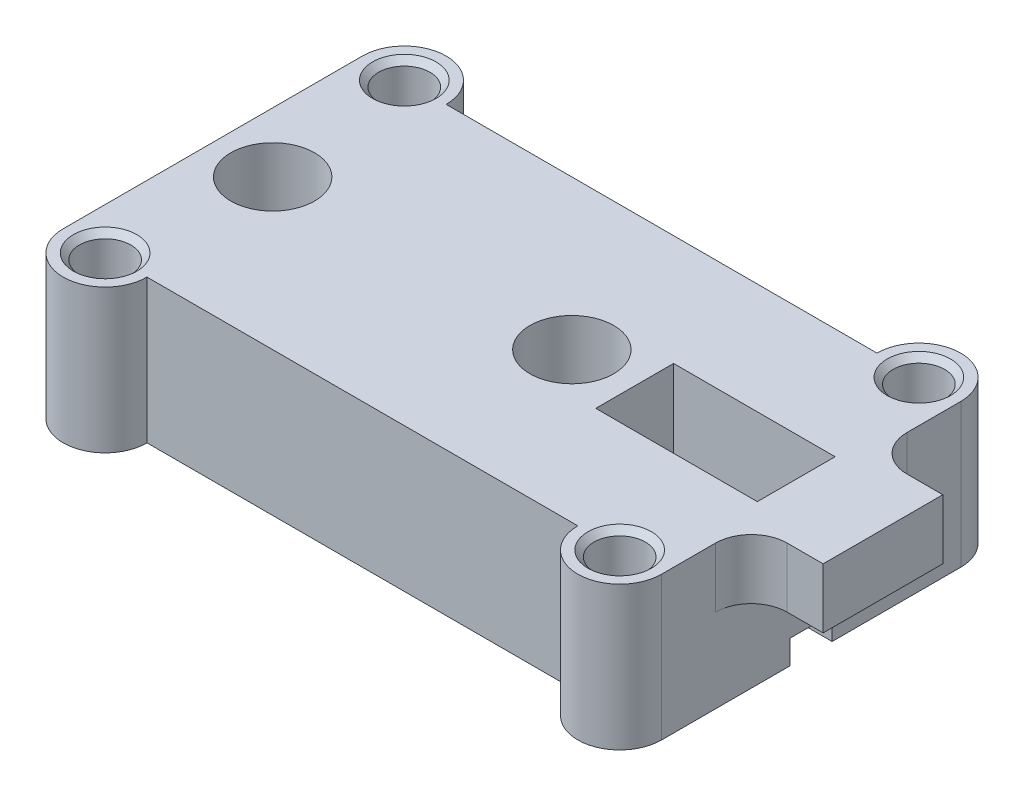
ISO-10303-21;
HEADER;
FILE_DESCRIPTION(('STEP AP214'),'2;1');
FILE_NAME('part.step','',(''),(''),'','','');
FILE_SCHEMA(('AUTOMOTIVE_DESIGN { 1 0 10303 214 1 1 1 1 }'));
ENDSEC;
DATA;
#1=APPLICATION_CONTEXT('core data for automotive mechanical design processes');
#2=APPLICATION_PROTOCOL_DEFINITION('international standard','automotive_design',2000,#1);
#3=PRODUCT_CONTEXT('',#1,'mechanical');
#4=PRODUCT('Part','Part','',(#3));
#5=PRODUCT_RELATED_PRODUCT_CATEGORY('part','',(#4));
#6=PRODUCT_DEFINITION_FORMATION('','',#4);
#7=PRODUCT_DEFINITION_CONTEXT('part definition',#1,'design');
#8=PRODUCT_DEFINITION('design','',#6,#7);
#9=PRODUCT_DEFINITION_SHAPE('','',#8);
#10=(LENGTH_UNIT() NAMED_UNIT(*) SI_UNIT(.MILLI.,.METRE.));
#11=(NAMED_UNIT(*) PLANE_ANGLE_UNIT() SI_UNIT($,.RADIAN.));
#12=(NAMED_UNIT(*) SI_UNIT($,.STERADIAN.) SOLID_ANGLE_UNIT());
#13=UNCERTAINTY_MEASURE_WITH_UNIT(LENGTH_MEASURE(1.E-05),#10,'distance_accuracy_value','');
#14=(GEOMETRIC_REPRESENTATION_CONTEXT(3) GLOBAL_UNCERTAINTY_ASSIGNED_CONTEXT((#13)) GLOBAL_UNIT_ASSIGNED_CONTEXT((#10,
#11,#12)) REPRESENTATION_CONTEXT('',''));
#15=CARTESIAN_POINT('',(0.,0.,0.));
#16=DIRECTION('',(0.,0.,1.));
#17=DIRECTION('',(1.,0.,0.));
#18=AXIS2_PLACEMENT_3D('',#15,#16,#17);
#19=CARTESIAN_POINT('',(-20.,12.,0.));
#20=DIRECTION('',(0.,-1.,0.));
#21=DIRECTION('',(0.,0.,1.));
#22=AXIS2_PLACEMENT_3D('',#19,#20,#21);
#23=CYLINDRICAL_SURFACE('',#22,1.75);
#24=CARTESIAN_POINT('',(-20.,0.,0.));
#25=DIRECTION('',(0.,-1.,0.));
#26=DIRECTION('',(0.,0.,-1.));
#27=AXIS2_PLACEMENT_3D('',#24,#25,#26);
#28=CIRCLE('',#27,1.75);
#29=CARTESIAN_POINT('',(-20.,0.,-1.75));
#30=VERTEX_POINT('',#29);
#31=EDGE_CURVE('E446',#30,#30,#28,.T.);
#32=ORIENTED_EDGE('',*,*,#31,.T.);
#33=EDGE_LOOP('',(#32));
#34=FACE_BOUND('',#33,.T.);
#35=CARTESIAN_POINT('',(-20.,3.5,0.));
#36=DIRECTION('',(0.,-1.,0.));
#37=DIRECTION('',(0.,0.,-1.));
#38=AXIS2_PLACEMENT_3D('',#35,#36,#37);
#39=CIRCLE('',#38,1.75);
#40=CARTESIAN_POINT('',(-20.,3.5,-1.75));
#41=VERTEX_POINT('',#40);
#42=EDGE_CURVE('E320',#41,#41,#39,.F.);
#43=ORIENTED_EDGE('',*,*,#42,.T.);
#44=EDGE_LOOP('',(#43));
#45=FACE_BOUND('',#44,.T.);
#46=ADVANCED_FACE('F45',(#34,#45),#23,.F.);
#47=CARTESIAN_POINT('',(5.,12.,0.));
#48=DIRECTION('',(0.,-1.,0.));
#49=DIRECTION('',(0.,0.,1.));
#50=AXIS2_PLACEMENT_3D('',#47,#48,#49);
#51=CYLINDRICAL_SURFACE('',#50,1.75);
#52=CARTESIAN_POINT('',(5.,0.,0.));
#53=DIRECTION('',(0.,-1.,0.));
#54=DIRECTION('',(0.,0.,-1.));
#55=AXIS2_PLACEMENT_3D('',#52,#53,#54);
#56=CIRCLE('',#55,1.75);
#57=CARTESIAN_POINT('',(5.,0.,-1.75));
#58=VERTEX_POINT('',#57);
#59=EDGE_CURVE('E244',#58,#58,#56,.T.);
#60=ORIENTED_EDGE('',*,*,#59,.T.);
#61=EDGE_LOOP('',(#60));
#62=FACE_BOUND('',#61,.T.);
#63=CARTESIAN_POINT('',(5.,3.5,0.));
#64=DIRECTION('',(0.,-1.,0.));
#65=DIRECTION('',(0.,0.,-1.));
#66=AXIS2_PLACEMENT_3D('',#63,#64,#65);
#67=CIRCLE('',#66,1.75);
#68=CARTESIAN_POINT('',(5.,3.5,-1.75));
#69=VERTEX_POINT('',#68);
#70=EDGE_CURVE('E330',#69,#69,#67,.F.);
#71=ORIENTED_EDGE('',*,*,#70,.T.);
#72=EDGE_LOOP('',(#71));
#73=FACE_BOUND('',#72,.T.);
#74=ADVANCED_FACE('F514',(#62,#73),#51,.F.);
#75=CARTESIAN_POINT('',(0.,12.,1.75));
#76=DIRECTION('',(0.,0.,1.));
#77=DIRECTION('',(-1.,0.,0.));
#78=AXIS2_PLACEMENT_3D('',#75,#76,#77);
#79=PLANE('',#78);
#80=DIRECTION('',(-1.,0.,0.));
#81=VECTOR('',#80,1.);
#82=CARTESIAN_POINT('',(0.,2.7,1.75));
#83=LINE('',#82,#81);
#84=CARTESIAN_POINT('',(23.75,2.7,1.75));
#85=VERTEX_POINT('',#84);
#86=CARTESIAN_POINT('',(10.25,2.7,1.75));
#87=VERTEX_POINT('',#86);
#88=EDGE_CURVE('E233',#85,#87,#83,.T.);
#89=ORIENTED_EDGE('',*,*,#88,.F.);
#90=DIRECTION('',(0.,-1.,0.));
#91=VECTOR('',#90,1.);
#92=CARTESIAN_POINT('',(23.75,12.,1.75));
#93=LINE('',#92,#91);
#94=CARTESIAN_POINT('',(23.75,2.,1.75));
#95=VERTEX_POINT('',#94);
#96=EDGE_CURVE('E213',#85,#95,#93,.T.);
#97=ORIENTED_EDGE('',*,*,#96,.T.);
#98=DIRECTION('',(1.,0.,0.));
#99=VECTOR('',#98,1.);
#100=CARTESIAN_POINT('',(0.,2.,1.75));
#101=LINE('',#100,#99);
#102=CARTESIAN_POINT('',(25.,2.,1.75));
#103=VERTEX_POINT('',#102);
#104=EDGE_CURVE('E220',#95,#103,#101,.T.);
#105=ORIENTED_EDGE('',*,*,#104,.T.);
#106=DIRECTION('',(0.,-1.,0.));
#107=VECTOR('',#106,1.);
#108=CARTESIAN_POINT('',(25.,2.,1.75));
#109=LINE('',#108,#107);
#110=CARTESIAN_POINT('',(25.,0.,1.75));
#111=VERTEX_POINT('',#110);
#112=EDGE_CURVE('E475',#103,#111,#109,.T.);
#113=ORIENTED_EDGE('',*,*,#112,.T.);
#114=DIRECTION('',(1.,0.,0.));
#115=VECTOR('',#114,1.);
#116=CARTESIAN_POINT('',(0.,0.,1.75));
#117=LINE('',#116,#115);
#118=CARTESIAN_POINT('',(10.25,0.,1.75));
#119=VERTEX_POINT('',#118);
#120=EDGE_CURVE('E444',#119,#111,#117,.T.);
#121=ORIENTED_EDGE('',*,*,#120,.F.);
#122=DIRECTION('',(0.,-1.,0.));
#123=VECTOR('',#122,1.);
#124=CARTESIAN_POINT('',(10.25,12.,1.75));
#125=LINE('',#124,#123);
#126=EDGE_CURVE('E234',#87,#119,#125,.T.);
#127=ORIENTED_EDGE('',*,*,#126,.F.);
#128=EDGE_LOOP('',(#89,#97,#105,#113,#121,#127));
#129=FACE_BOUND('',#128,.T.);
#130=ADVANCED_FACE('F230',(#129),#79,.F.);
#131=CARTESIAN_POINT('',(0.,12.,0.));
#132=DIRECTION('',(0.,1.,0.));
#133=DIRECTION('',(0.,0.,-1.));
#134=AXIS2_PLACEMENT_3D('',#131,#132,#133);
#135=PLANE('',#134);
#136=CARTESIAN_POINT('',(21.5,12.,12.5));
#137=DIRECTION('',(0.,-1.,0.));
#138=DIRECTION('',(0.,0.,-1.));
#139=AXIS2_PLACEMENT_3D('',#136,#137,#138);
#140=CIRCLE('',#139,2.64999999999999);
#141=CARTESIAN_POINT('',(21.5,12.,9.85000000000001));
#142=VERTEX_POINT('',#141);
#143=EDGE_CURVE('E299',#142,#142,#140,.F.);
#144=ORIENTED_EDGE('',*,*,#143,.F.);
#145=EDGE_LOOP('',(#144));
#146=FACE_BOUND('',#145,.T.);
#147=CARTESIAN_POINT('',(-21.5,12.,12.5));
#148=DIRECTION('',(0.,-1.,0.));
#149=DIRECTION('',(0.,0.,-1.));
#150=AXIS2_PLACEMENT_3D('',#147,#148,#149);
#151=CIRCLE('',#150,2.64999999999999);
#152=CARTESIAN_POINT('',(-21.5,12.,9.85000000000001));
#153=VERTEX_POINT('',#152);
#154=EDGE_CURVE('E296',#153,#153,#151,.F.);
#155=ORIENTED_EDGE('',*,*,#154,.F.);
#156=EDGE_LOOP('',(#155));
#157=FACE_BOUND('',#156,.T.);
#158=CARTESIAN_POINT('',(-21.5,12.,-12.5));
#159=DIRECTION('',(0.,-1.,0.));
#160=DIRECTION('',(0.,0.,-1.));
#161=AXIS2_PLACEMENT_3D('',#158,#159,#160);
#162=CIRCLE('',#161,2.64999999999999);
#163=CARTESIAN_POINT('',(-21.5,12.,-15.15));
#164=VERTEX_POINT('',#163);
#165=EDGE_CURVE('E293',#164,#164,#162,.F.);
#166=ORIENTED_EDGE('',*,*,#165,.F.);
#167=EDGE_LOOP('',(#166));
#168=FACE_BOUND('',#167,.T.);
#169=CARTESIAN_POINT('',(21.5,12.,-12.5));
#170=DIRECTION('',(0.,-1.,0.));
#171=DIRECTION('',(0.,0.,-1.));
#172=AXIS2_PLACEMENT_3D('',#169,#170,#171);
#173=CIRCLE('',#172,2.64999999999999);
#174=CARTESIAN_POINT('',(21.5,12.,-15.15));
#175=VERTEX_POINT('',#174);
#176=EDGE_CURVE('E290',#175,#175,#173,.F.);
#177=ORIENTED_EDGE('',*,*,#176,.F.);
#178=EDGE_LOOP('',(#177));
#179=FACE_BOUND('',#178,.T.);
#180=CARTESIAN_POINT('',(-20.,12.,0.));
#181=DIRECTION('',(0.,-1.,0.));
#182=DIRECTION('',(0.,0.,-1.));
#183=AXIS2_PLACEMENT_3D('',#180,#181,#182);
#184=CIRCLE('',#183,3.5);
#185=CARTESIAN_POINT('',(-20.,12.,-3.5));
#186=VERTEX_POINT('',#185);
#187=EDGE_CURVE('E486',#186,#186,#184,.T.);
#188=ORIENTED_EDGE('',*,*,#187,.T.);
#189=EDGE_LOOP('',(#188));
#190=FACE_BOUND('',#189,.T.);
#191=CARTESIAN_POINT('',(5.,12.,0.));
#192=DIRECTION('',(0.,-1.,0.));
#193=DIRECTION('',(0.,0.,-1.));
#194=AXIS2_PLACEMENT_3D('',#191,#192,#193);
#195=CIRCLE('',#194,3.5);
#196=CARTESIAN_POINT('',(5.,12.,-3.5));
#197=VERTEX_POINT('',#196);
#198=EDGE_CURVE('E479',#197,#197,#195,.T.);
#199=ORIENTED_EDGE('',*,*,#198,.T.);
#200=EDGE_LOOP('',(#199));
#201=FACE_BOUND('',#200,.T.);
#202=DIRECTION('',(0.,0.,1.));
#203=VECTOR('',#202,1.);
#204=CARTESIAN_POINT('',(25.,12.,0.));
#205=LINE('',#204,#203);
#206=CARTESIAN_POINT('',(25.,12.,-12.5));
#207=VERTEX_POINT('',#206);
#208=CARTESIAN_POINT('',(25.,12.,-8.00000000000001));
#209=VERTEX_POINT('',#208);
#210=EDGE_CURVE('E391',#207,#209,#205,.T.);
#211=ORIENTED_EDGE('',*,*,#210,.F.);
#212=CARTESIAN_POINT('',(21.5,12.,-12.5));
#213=DIRECTION('',(0.,-1.,0.));
#214=DIRECTION('',(0.,0.,-1.));
#215=AXIS2_PLACEMENT_3D('',#212,#213,#214);
#216=CIRCLE('',#215,3.5);
#217=CARTESIAN_POINT('',(18.,12.,-12.5));
#218=VERTEX_POINT('',#217);
#219=EDGE_CURVE('E413',#218,#207,#216,.T.);
#220=ORIENTED_EDGE('',*,*,#219,.F.);
#221=DIRECTION('',(1.,0.,0.));
#222=VECTOR('',#221,1.);
#223=CARTESIAN_POINT('',(0.,12.,-12.5));
#224=LINE('',#223,#222);
#225=CARTESIAN_POINT('',(-18.,12.,-12.5));
#226=VERTEX_POINT('',#225);
#227=EDGE_CURVE('E410',#226,#218,#224,.T.);
#228=ORIENTED_EDGE('',*,*,#227,.F.);
#229=CARTESIAN_POINT('',(-21.5,12.,-12.5));
#230=DIRECTION('',(0.,-1.,0.));
#231=DIRECTION('',(0.,0.,-1.));
#232=AXIS2_PLACEMENT_3D('',#229,#230,#231);
#233=CIRCLE('',#232,3.5);
#234=CARTESIAN_POINT('',(-25.,12.,-12.5));
#235=VERTEX_POINT('',#234);
#236=EDGE_CURVE('E407',#226,#235,#233,.F.);
#237=ORIENTED_EDGE('',*,*,#236,.T.);
#238=DIRECTION('',(0.,0.,1.));
#239=VECTOR('',#238,1.);
#240=CARTESIAN_POINT('',(-25.,12.,0.));
#241=LINE('',#240,#239);
#242=CARTESIAN_POINT('',(-25.,12.,12.5));
#243=VERTEX_POINT('',#242);
#244=EDGE_CURVE('E404',#235,#243,#241,.T.);
#245=ORIENTED_EDGE('',*,*,#244,.T.);
#246=CARTESIAN_POINT('',(-21.5,12.,12.5));
#247=DIRECTION('',(0.,-1.,0.));
#248=DIRECTION('',(0.,0.,-1.));
#249=AXIS2_PLACEMENT_3D('',#246,#247,#248);
#250=CIRCLE('',#249,3.5);
#251=CARTESIAN_POINT('',(-18.,12.,12.5));
#252=VERTEX_POINT('',#251);
#253=EDGE_CURVE('E401',#252,#243,#250,.T.);
#254=ORIENTED_EDGE('',*,*,#253,.F.);
#255=DIRECTION('',(1.,0.,0.));
#256=VECTOR('',#255,1.);
#257=CARTESIAN_POINT('',(0.,12.,12.5));
#258=LINE('',#257,#256);
#259=CARTESIAN_POINT('',(18.,12.,12.5));
#260=VERTEX_POINT('',#259);
#261=EDGE_CURVE('E398',#252,#260,#258,.T.);
#262=ORIENTED_EDGE('',*,*,#261,.T.);
#263=CARTESIAN_POINT('',(21.5,12.,12.5));
#264=DIRECTION('',(0.,-1.,0.));
#265=DIRECTION('',(0.,0.,-1.));
#266=AXIS2_PLACEMENT_3D('',#263,#264,#265);
#267=CIRCLE('',#266,3.5);
#268=CARTESIAN_POINT('',(25.,12.,12.5));
#269=VERTEX_POINT('',#268);
#270=EDGE_CURVE('E394',#260,#269,#267,.F.);
#271=ORIENTED_EDGE('',*,*,#270,.T.);
#272=CARTESIAN_POINT('',(25.,12.,7.99999999999999));
#273=VERTEX_POINT('',#272);
#274=EDGE_CURVE('E395',#273,#269,#205,.T.);
#275=ORIENTED_EDGE('',*,*,#274,.F.);
#276=CARTESIAN_POINT('',(28.,12.,7.99999999999999));
#277=DIRECTION('',(0.,-1.,0.));
#278=DIRECTION('',(0.,0.,-1.));
#279=AXIS2_PLACEMENT_3D('',#276,#277,#278);
#280=CIRCLE('',#279,3.);
#281=CARTESIAN_POINT('',(28.,12.,4.99999999999999));
#282=VERTEX_POINT('',#281);
#283=EDGE_CURVE('E279',#282,#273,#280,.F.);
#284=ORIENTED_EDGE('',*,*,#283,.F.);
#285=DIRECTION('',(1.,0.,0.));
#286=VECTOR('',#285,1.);
#287=CARTESIAN_POINT('',(0.,12.,4.99999999999999));
#288=LINE('',#287,#286);
#289=CARTESIAN_POINT('',(31.,12.,4.99999999999999));
#290=VERTEX_POINT('',#289);
#291=EDGE_CURVE('E357',#282,#290,#288,.T.);
#292=ORIENTED_EDGE('',*,*,#291,.T.);
#293=DIRECTION('',(0.,0.,1.));
#294=VECTOR('',#293,1.);
#295=CARTESIAN_POINT('',(31.,12.,0.));
#296=LINE('',#295,#294);
#297=CARTESIAN_POINT('',(31.,12.,-5.00000000000001));
#298=VERTEX_POINT('',#297);
#299=EDGE_CURVE('E383',#298,#290,#296,.T.);
#300=ORIENTED_EDGE('',*,*,#299,.F.);
#301=DIRECTION('',(1.,0.,0.));
#302=VECTOR('',#301,1.);
#303=CARTESIAN_POINT('',(0.,12.,-5.00000000000001));
#304=LINE('',#303,#302);
#305=CARTESIAN_POINT('',(28.,12.,-5.00000000000001));
#306=VERTEX_POINT('',#305);
#307=EDGE_CURVE('E374',#306,#298,#304,.T.);
#308=ORIENTED_EDGE('',*,*,#307,.F.);
#309=CARTESIAN_POINT('',(28.,12.,-8.00000000000001));
#310=DIRECTION('',(0.,-1.,0.));
#311=DIRECTION('',(0.,0.,-1.));
#312=AXIS2_PLACEMENT_3D('',#309,#310,#311);
#313=CIRCLE('',#312,3.);
#314=EDGE_CURVE('E284',#209,#306,#313,.F.);
#315=ORIENTED_EDGE('',*,*,#314,.F.);
#316=EDGE_LOOP('',(#211,#220,#228,#237,#245,#254,#262,#271,#275,#284,#292,#300,#308,#315));
#317=FACE_BOUND('',#316,.T.);
#318=DIRECTION('',(0.,0.,1.));
#319=VECTOR('',#318,1.);
#320=CARTESIAN_POINT('',(23.75,12.,0.));
#321=LINE('',#320,#319);
#322=CARTESIAN_POINT('',(23.75,12.,-3.25));
#323=VERTEX_POINT('',#322);
#324=CARTESIAN_POINT('',(23.75,12.,3.25));
#325=VERTEX_POINT('',#324);
#326=EDGE_CURVE('E416',#323,#325,#321,.T.);
#327=ORIENTED_EDGE('',*,*,#326,.T.);
#328=DIRECTION('',(-1.,0.,0.));
#329=VECTOR('',#328,1.);
#330=CARTESIAN_POINT('',(0.,12.,3.25));
#331=LINE('',#330,#329);
#332=CARTESIAN_POINT('',(10.25,12.,3.25));
#333=VERTEX_POINT('',#332);
#334=EDGE_CURVE('E337',#325,#333,#331,.T.);
#335=ORIENTED_EDGE('',*,*,#334,.T.);
#336=DIRECTION('',(0.,0.,1.));
#337=VECTOR('',#336,1.);
#338=CARTESIAN_POINT('',(10.25,12.,0.));
#339=LINE('',#338,#337);
#340=CARTESIAN_POINT('',(10.25,12.,-3.25));
#341=VERTEX_POINT('',#340);
#342=EDGE_CURVE('E255',#341,#333,#339,.T.);
#343=ORIENTED_EDGE('',*,*,#342,.F.);
#344=DIRECTION('',(-1.,0.,0.));
#345=VECTOR('',#344,1.);
#346=CARTESIAN_POINT('',(0.,12.,-3.25));
#347=LINE('',#346,#345);
#348=EDGE_CURVE('E342',#323,#341,#347,.T.);
#349=ORIENTED_EDGE('',*,*,#348,.F.);
#350=EDGE_LOOP('',(#327,#335,#343,#349));
#351=FACE_BOUND('',#350,.T.);
#352=ADVANCED_FACE('F462',(#146,#157,#168,#179,#190,#201,#317,#351),#135,.T.);
#353=CARTESIAN_POINT('',(25.,12.,0.));
#354=DIRECTION('',(-1.,0.,0.));
#355=DIRECTION('',(0.,0.,-1.));
#356=AXIS2_PLACEMENT_3D('',#353,#354,#355);
#357=PLANE('',#356);
#358=ORIENTED_EDGE('',*,*,#274,.T.);
#359=DIRECTION('',(0.,-1.,0.));
#360=VECTOR('',#359,1.);
#361=CARTESIAN_POINT('',(25.,12.,12.5));
#362=LINE('',#361,#360);
#363=CARTESIAN_POINT('',(25.,0.,12.5));
#364=VERTEX_POINT('',#363);
#365=EDGE_CURVE('E235',#269,#364,#362,.T.);
#366=ORIENTED_EDGE('',*,*,#365,.T.);
#367=DIRECTION('',(0.,0.,1.));
#368=VECTOR('',#367,1.);
#369=CARTESIAN_POINT('',(25.,0.,0.));
#370=LINE('',#369,#368);
#371=EDGE_CURVE('E390',#111,#364,#370,.T.);
#372=ORIENTED_EDGE('',*,*,#371,.F.);
#373=ORIENTED_EDGE('',*,*,#112,.F.);
#374=DIRECTION('',(0.,0.,1.));
#375=VECTOR('',#374,1.);
#376=CARTESIAN_POINT('',(25.,2.,0.));
#377=LINE('',#376,#375);
#378=CARTESIAN_POINT('',(25.,2.,-1.75));
#379=VERTEX_POINT('',#378);
#380=EDGE_CURVE('E225',#379,#103,#377,.T.);
#381=ORIENTED_EDGE('',*,*,#380,.F.);
#382=DIRECTION('',(0.,-1.,0.));
#383=VECTOR('',#382,1.);
#384=CARTESIAN_POINT('',(25.,2.,-1.75));
#385=LINE('',#384,#383);
#386=CARTESIAN_POINT('',(25.,0.,-1.75));
#387=VERTEX_POINT('',#386);
#388=EDGE_CURVE('E477',#379,#387,#385,.T.);
#389=ORIENTED_EDGE('',*,*,#388,.T.);
#390=CARTESIAN_POINT('',(25.,0.,-12.5));
#391=VERTEX_POINT('',#390);
#392=EDGE_CURVE('E421',#391,#387,#370,.T.);
#393=ORIENTED_EDGE('',*,*,#392,.F.);
#394=DIRECTION('',(0.,-1.,0.));
#395=VECTOR('',#394,1.);
#396=CARTESIAN_POINT('',(25.,12.,-12.5));
#397=LINE('',#396,#395);
#398=EDGE_CURVE('E251',#207,#391,#397,.T.);
#399=ORIENTED_EDGE('',*,*,#398,.F.);
#400=ORIENTED_EDGE('',*,*,#210,.T.);
#401=DIRECTION('',(0.,1.,0.));
#402=VECTOR('',#401,1.);
#403=CARTESIAN_POINT('',(25.,12.,-8.00000000000001));
#404=LINE('',#403,#402);
#405=CARTESIAN_POINT('',(25.,7.,-8.00000000000001));
#406=VERTEX_POINT('',#405);
#407=EDGE_CURVE('E273',#406,#209,#404,.T.);
#408=ORIENTED_EDGE('',*,*,#407,.F.);
#409=DIRECTION('',(0.,0.,-1.));
#410=VECTOR('',#409,1.);
#411=CARTESIAN_POINT('',(25.,7.,0.));
#412=LINE('',#411,#410);
#413=CARTESIAN_POINT('',(25.,7.,7.99999999999999));
#414=VERTEX_POINT('',#413);
#415=EDGE_CURVE('E378',#414,#406,#412,.T.);
#416=ORIENTED_EDGE('',*,*,#415,.F.);
#417=DIRECTION('',(0.,1.,0.));
#418=VECTOR('',#417,1.);
#419=CARTESIAN_POINT('',(25.,7.,7.99999999999999));
#420=LINE('',#419,#418);
#421=EDGE_CURVE('E275',#273,#414,#420,.F.);
#422=ORIENTED_EDGE('',*,*,#421,.F.);
#423=EDGE_LOOP('',(#358,#366,#372,#373,#381,#389,#393,#399,#400,#408,#416,#422));
#424=FACE_BOUND('',#423,.T.);
#425=ADVANCED_FACE('F456',(#424),#357,.F.);
#426=CARTESIAN_POINT('',(23.75,12.,0.));
#427=DIRECTION('',(-1.,0.,0.));
#428=DIRECTION('',(0.,0.,-1.));
#429=AXIS2_PLACEMENT_3D('',#426,#427,#428);
#430=PLANE('',#429);
#431=DIRECTION('',(0.,0.,1.));
#432=VECTOR('',#431,1.);
#433=CARTESIAN_POINT('',(23.75,2.,0.));
#434=LINE('',#433,#432);
#435=CARTESIAN_POINT('',(23.75,2.,-1.75));
#436=VERTEX_POINT('',#435);
#437=EDGE_CURVE('E208',#436,#95,#434,.T.);
#438=ORIENTED_EDGE('',*,*,#437,.T.);
#439=ORIENTED_EDGE('',*,*,#96,.F.);
#440=DIRECTION('',(0.,0.,-1.));
#441=VECTOR('',#440,1.);
#442=CARTESIAN_POINT('',(23.75,2.7,0.));
#443=LINE('',#442,#441);
#444=CARTESIAN_POINT('',(23.75,2.7,3.25));
#445=VERTEX_POINT('',#444);
#446=EDGE_CURVE('E363',#445,#85,#443,.T.);
#447=ORIENTED_EDGE('',*,*,#446,.F.);
#448=DIRECTION('',(0.,1.,0.));
#449=VECTOR('',#448,1.);
#450=CARTESIAN_POINT('',(23.75,2.7,3.25));
#451=LINE('',#450,#449);
#452=EDGE_CURVE('E353',#445,#325,#451,.T.);
#453=ORIENTED_EDGE('',*,*,#452,.T.);
#454=ORIENTED_EDGE('',*,*,#326,.F.);
#455=DIRECTION('',(0.,1.,0.));
#456=VECTOR('',#455,1.);
#457=CARTESIAN_POINT('',(23.75,2.7,-3.25));
#458=LINE('',#457,#456);
#459=CARTESIAN_POINT('',(23.75,2.7,-3.25));
#460=VERTEX_POINT('',#459);
#461=EDGE_CURVE('E355',#460,#323,#458,.T.);
#462=ORIENTED_EDGE('',*,*,#461,.F.);
#463=DIRECTION('',(0.,0.,-1.));
#464=VECTOR('',#463,1.);
#465=CARTESIAN_POINT('',(23.75,2.7,0.));
#466=LINE('',#465,#464);
#467=CARTESIAN_POINT('',(23.75,2.7,-1.75));
#468=VERTEX_POINT('',#467);
#469=EDGE_CURVE('E338',#468,#460,#466,.T.);
#470=ORIENTED_EDGE('',*,*,#469,.F.);
#471=DIRECTION('',(0.,-1.,0.));
#472=VECTOR('',#471,1.);
#473=CARTESIAN_POINT('',(23.75,12.,-1.75));
#474=LINE('',#473,#472);
#475=EDGE_CURVE('E217',#468,#436,#474,.T.);
#476=ORIENTED_EDGE('',*,*,#475,.T.);
#477=EDGE_LOOP('',(#438,#439,#447,#453,#454,#462,#470,#476));
#478=FACE_BOUND('',#477,.T.);
#479=ADVANCED_FACE('F210',(#478),#430,.T.);
#480=CARTESIAN_POINT('',(0.,12.,-1.75));
#481=DIRECTION('',(0.,0.,1.));
#482=DIRECTION('',(-1.,0.,0.));
#483=AXIS2_PLACEMENT_3D('',#480,#481,#482);
#484=PLANE('',#483);
#485=DIRECTION('',(-1.,0.,0.));
#486=VECTOR('',#485,1.);
#487=CARTESIAN_POINT('',(0.,2.7,-1.75));
#488=LINE('',#487,#486);
#489=CARTESIAN_POINT('',(10.25,2.7,-1.75));
#490=VERTEX_POINT('',#489);
#491=EDGE_CURVE('E347',#468,#490,#488,.T.);
#492=ORIENTED_EDGE('',*,*,#491,.T.);
#493=DIRECTION('',(0.,-1.,0.));
#494=VECTOR('',#493,1.);
#495=CARTESIAN_POINT('',(10.25,12.,-1.75));
#496=LINE('',#495,#494);
#497=CARTESIAN_POINT('',(10.25,0.,-1.75));
#498=VERTEX_POINT('',#497);
#499=EDGE_CURVE('E238',#490,#498,#496,.T.);
#500=ORIENTED_EDGE('',*,*,#499,.T.);
#501=DIRECTION('',(1.,0.,0.));
#502=VECTOR('',#501,1.);
#503=CARTESIAN_POINT('',(0.,0.,-1.75));
#504=LINE('',#503,#502);
#505=EDGE_CURVE('E440',#498,#387,#504,.T.);
#506=ORIENTED_EDGE('',*,*,#505,.T.);
#507=ORIENTED_EDGE('',*,*,#388,.F.);
#508=DIRECTION('',(1.,0.,0.));
#509=VECTOR('',#508,1.);
#510=CARTESIAN_POINT('',(0.,2.,-1.75));
#511=LINE('',#510,#509);
#512=EDGE_CURVE('E219',#436,#379,#511,.T.);
#513=ORIENTED_EDGE('',*,*,#512,.F.);
#514=ORIENTED_EDGE('',*,*,#475,.F.);
#515=EDGE_LOOP('',(#492,#500,#506,#507,#513,#514));
#516=FACE_BOUND('',#515,.T.);
#517=ADVANCED_FACE('F528',(#516),#484,.T.);
#518=CARTESIAN_POINT('',(10.25,12.,0.));
#519=DIRECTION('',(-1.,0.,0.));
#520=DIRECTION('',(0.,0.,-1.));
#521=AXIS2_PLACEMENT_3D('',#518,#519,#520);
#522=PLANE('',#521);
#523=DIRECTION('',(0.,0.,1.));
#524=VECTOR('',#523,1.);
#525=CARTESIAN_POINT('',(10.25,0.,0.));
#526=LINE('',#525,#524);
#527=EDGE_CURVE('E442',#498,#119,#526,.T.);
#528=ORIENTED_EDGE('',*,*,#527,.F.);
#529=ORIENTED_EDGE('',*,*,#499,.F.);
#530=DIRECTION('',(0.,0.,-1.));
#531=VECTOR('',#530,1.);
#532=CARTESIAN_POINT('',(10.25,2.7,0.));
#533=LINE('',#532,#531);
#534=CARTESIAN_POINT('',(10.25,2.7,-3.25));
#535=VERTEX_POINT('',#534);
#536=EDGE_CURVE('E344',#490,#535,#533,.T.);
#537=ORIENTED_EDGE('',*,*,#536,.T.);
#538=DIRECTION('',(0.,1.,0.));
#539=VECTOR('',#538,1.);
#540=CARTESIAN_POINT('',(10.25,2.7,-3.25));
#541=LINE('',#540,#539);
#542=EDGE_CURVE('E350',#535,#341,#541,.T.);
#543=ORIENTED_EDGE('',*,*,#542,.T.);
#544=ORIENTED_EDGE('',*,*,#342,.T.);
#545=DIRECTION('',(0.,1.,0.));
#546=VECTOR('',#545,1.);
#547=CARTESIAN_POINT('',(10.25,2.7,3.25));
#548=LINE('',#547,#546);
#549=CARTESIAN_POINT('',(10.25,2.7,3.25));
#550=VERTEX_POINT('',#549);
#551=EDGE_CURVE('E365',#550,#333,#548,.T.);
#552=ORIENTED_EDGE('',*,*,#551,.F.);
#553=DIRECTION('',(0.,0.,-1.));
#554=VECTOR('',#553,1.);
#555=CARTESIAN_POINT('',(10.25,2.7,0.));
#556=LINE('',#555,#554);
#557=EDGE_CURVE('E360',#550,#87,#556,.T.);
#558=ORIENTED_EDGE('',*,*,#557,.T.);
#559=ORIENTED_EDGE('',*,*,#126,.T.);
#560=EDGE_LOOP('',(#528,#529,#537,#543,#544,#552,#558,#559));
#561=FACE_BOUND('',#560,.T.);
#562=ADVANCED_FACE('F525',(#561),#522,.F.);
#563=CARTESIAN_POINT('',(21.5,12.,12.5));
#564=DIRECTION('',(0.,-1.,0.));
#565=DIRECTION('',(0.,0.,1.));
#566=AXIS2_PLACEMENT_3D('',#563,#564,#565);
#567=CYLINDRICAL_SURFACE('',#566,3.5);
#568=CARTESIAN_POINT('',(21.5,0.,12.5));
#569=DIRECTION('',(0.,-1.,0.));
#570=DIRECTION('',(0.,0.,-1.));
#571=AXIS2_PLACEMENT_3D('',#568,#569,#570);
#572=CIRCLE('',#571,3.5);
#573=CARTESIAN_POINT('',(18.,0.,12.5));
#574=VERTEX_POINT('',#573);
#575=EDGE_CURVE('E424',#574,#364,#572,.F.);
#576=ORIENTED_EDGE('',*,*,#575,.T.);
#577=ORIENTED_EDGE('',*,*,#365,.F.);
#578=ORIENTED_EDGE('',*,*,#270,.F.);
#579=DIRECTION('',(0.,-1.,0.));
#580=VECTOR('',#579,1.);
#581=CARTESIAN_POINT('',(18.,12.,12.5));
#582=LINE('',#581,#580);
#583=EDGE_CURVE('E241',#260,#574,#582,.T.);
#584=ORIENTED_EDGE('',*,*,#583,.T.);
#585=EDGE_LOOP('',(#576,#577,#578,#584));
#586=FACE_BOUND('',#585,.T.);
#587=ADVANCED_FACE('F467',(#586),#567,.T.);
#588=CARTESIAN_POINT('',(0.,12.,12.5));
#589=DIRECTION('',(0.,0.,1.));
#590=DIRECTION('',(-1.,0.,0.));
#591=AXIS2_PLACEMENT_3D('',#588,#589,#590);
#592=PLANE('',#591);
#593=DIRECTION('',(1.,0.,0.));
#594=VECTOR('',#593,1.);
#595=CARTESIAN_POINT('',(0.,0.,12.5));
#596=LINE('',#595,#594);
#597=CARTESIAN_POINT('',(-18.,0.,12.5));
#598=VERTEX_POINT('',#597);
#599=EDGE_CURVE('E426',#598,#574,#596,.T.);
#600=ORIENTED_EDGE('',*,*,#599,.T.);
#601=ORIENTED_EDGE('',*,*,#583,.F.);
#602=ORIENTED_EDGE('',*,*,#261,.F.);
#603=DIRECTION('',(0.,-1.,0.));
#604=VECTOR('',#603,1.);
#605=CARTESIAN_POINT('',(-18.,12.,12.5));
#606=LINE('',#605,#604);
#607=EDGE_CURVE('E267',#252,#598,#606,.T.);
#608=ORIENTED_EDGE('',*,*,#607,.T.);
#609=EDGE_LOOP('',(#600,#601,#602,#608));
#610=FACE_BOUND('',#609,.T.);
#611=ADVANCED_FACE('F554',(#610),#592,.T.);
#612=CARTESIAN_POINT('',(-21.5,12.,12.5));
#613=DIRECTION('',(0.,-1.,0.));
#614=DIRECTION('',(0.,0.,1.));
#615=AXIS2_PLACEMENT_3D('',#612,#613,#614);
#616=CYLINDRICAL_SURFACE('',#615,3.5);
#617=CARTESIAN_POINT('',(-21.5,0.,12.5));
#618=DIRECTION('',(0.,-1.,0.));
#619=DIRECTION('',(0.,0.,-1.));
#620=AXIS2_PLACEMENT_3D('',#617,#618,#619);
#621=CIRCLE('',#620,3.5);
#622=CARTESIAN_POINT('',(-25.,0.,12.5));
#623=VERTEX_POINT('',#622);
#624=EDGE_CURVE('E428',#598,#623,#621,.T.);
#625=ORIENTED_EDGE('',*,*,#624,.F.);
#626=ORIENTED_EDGE('',*,*,#607,.F.);
#627=ORIENTED_EDGE('',*,*,#253,.T.);
#628=DIRECTION('',(0.,-1.,0.));
#629=VECTOR('',#628,1.);
#630=CARTESIAN_POINT('',(-25.,12.,12.5));
#631=LINE('',#630,#629);
#632=EDGE_CURVE('E264',#243,#623,#631,.T.);
#633=ORIENTED_EDGE('',*,*,#632,.T.);
#634=EDGE_LOOP('',(#625,#626,#627,#633));
#635=FACE_BOUND('',#634,.T.);
#636=ADVANCED_FACE('F550',(#635),#616,.T.);
#637=CARTESIAN_POINT('',(-25.,12.,0.));
#638=DIRECTION('',(-1.,0.,0.));
#639=DIRECTION('',(0.,0.,-1.));
#640=AXIS2_PLACEMENT_3D('',#637,#638,#639);
#641=PLANE('',#640);
#642=DIRECTION('',(0.,0.,1.));
#643=VECTOR('',#642,1.);
#644=CARTESIAN_POINT('',(-25.,0.,0.));
#645=LINE('',#644,#643);
#646=CARTESIAN_POINT('',(-25.,0.,-12.5));
#647=VERTEX_POINT('',#646);
#648=EDGE_CURVE('E431',#647,#623,#645,.T.);
#649=ORIENTED_EDGE('',*,*,#648,.T.);
#650=ORIENTED_EDGE('',*,*,#632,.F.);
#651=ORIENTED_EDGE('',*,*,#244,.F.);
#652=DIRECTION('',(0.,-1.,0.));
#653=VECTOR('',#652,1.);
#654=CARTESIAN_POINT('',(-25.,12.,-12.5));
#655=LINE('',#654,#653);
#656=EDGE_CURVE('E261',#235,#647,#655,.T.);
#657=ORIENTED_EDGE('',*,*,#656,.T.);
#658=EDGE_LOOP('',(#649,#650,#651,#657));
#659=FACE_BOUND('',#658,.T.);
#660=ADVANCED_FACE('F546',(#659),#641,.T.);
#661=CARTESIAN_POINT('',(-21.5,12.,-12.5));
#662=DIRECTION('',(0.,-1.,0.));
#663=DIRECTION('',(0.,0.,1.));
#664=AXIS2_PLACEMENT_3D('',#661,#662,#663);
#665=CYLINDRICAL_SURFACE('',#664,3.5);
#666=CARTESIAN_POINT('',(-21.5,0.,-12.5));
#667=DIRECTION('',(0.,-1.,0.));
#668=DIRECTION('',(0.,0.,-1.));
#669=AXIS2_PLACEMENT_3D('',#666,#667,#668);
#670=CIRCLE('',#669,3.5);
#671=CARTESIAN_POINT('',(-18.,0.,-12.5));
#672=VERTEX_POINT('',#671);
#673=EDGE_CURVE('E433',#672,#647,#670,.F.);
#674=ORIENTED_EDGE('',*,*,#673,.T.);
#675=ORIENTED_EDGE('',*,*,#656,.F.);
#676=ORIENTED_EDGE('',*,*,#236,.F.);
#677=DIRECTION('',(0.,-1.,0.));
#678=VECTOR('',#677,1.);
#679=CARTESIAN_POINT('',(-18.,12.,-12.5));
#680=LINE('',#679,#678);
#681=EDGE_CURVE('E258',#226,#672,#680,.T.);
#682=ORIENTED_EDGE('',*,*,#681,.T.);
#683=EDGE_LOOP('',(#674,#675,#676,#682));
#684=FACE_BOUND('',#683,.T.);
#685=ADVANCED_FACE('F542',(#684),#665,.T.);
#686=CARTESIAN_POINT('',(0.,12.,-12.5));
#687=DIRECTION('',(0.,0.,1.));
#688=DIRECTION('',(-1.,0.,0.));
#689=AXIS2_PLACEMENT_3D('',#686,#687,#688);
#690=PLANE('',#689);
#691=DIRECTION('',(1.,0.,0.));
#692=VECTOR('',#691,1.);
#693=CARTESIAN_POINT('',(0.,0.,-12.5));
#694=LINE('',#693,#692);
#695=CARTESIAN_POINT('',(18.,0.,-12.5));
#696=VERTEX_POINT('',#695);
#697=EDGE_CURVE('E435',#672,#696,#694,.T.);
#698=ORIENTED_EDGE('',*,*,#697,.F.);
#699=ORIENTED_EDGE('',*,*,#681,.F.);
#700=ORIENTED_EDGE('',*,*,#227,.T.);
#701=DIRECTION('',(0.,-1.,0.));
#702=VECTOR('',#701,1.);
#703=CARTESIAN_POINT('',(18.,12.,-12.5));
#704=LINE('',#703,#702);
#705=EDGE_CURVE('E254',#218,#696,#704,.T.);
#706=ORIENTED_EDGE('',*,*,#705,.T.);
#707=EDGE_LOOP('',(#698,#699,#700,#706));
#708=FACE_BOUND('',#707,.T.);
#709=ADVANCED_FACE('F538',(#708),#690,.F.);
#710=CARTESIAN_POINT('',(21.5,12.,-12.5));
#711=DIRECTION('',(0.,-1.,0.));
#712=DIRECTION('',(0.,0.,1.));
#713=AXIS2_PLACEMENT_3D('',#710,#711,#712);
#714=CYLINDRICAL_SURFACE('',#713,3.5);
#715=CARTESIAN_POINT('',(21.5,0.,-12.5));
#716=DIRECTION('',(0.,-1.,0.));
#717=DIRECTION('',(0.,0.,-1.));
#718=AXIS2_PLACEMENT_3D('',#715,#716,#717);
#719=CIRCLE('',#718,3.5);
#720=EDGE_CURVE('E438',#696,#391,#719,.T.);
#721=ORIENTED_EDGE('',*,*,#720,.F.);
#722=ORIENTED_EDGE('',*,*,#705,.F.);
#723=ORIENTED_EDGE('',*,*,#219,.T.);
#724=ORIENTED_EDGE('',*,*,#398,.T.);
#725=EDGE_LOOP('',(#721,#722,#723,#724));
#726=FACE_BOUND('',#725,.T.);
#727=ADVANCED_FACE('F535',(#726),#714,.T.);
#728=CARTESIAN_POINT('',(0.,0.,0.));
#729=DIRECTION('',(0.,1.,0.));
#730=DIRECTION('',(0.,0.,-1.));
#731=AXIS2_PLACEMENT_3D('',#728,#729,#730);
#732=PLANE('',#731);
#733=ORIENTED_EDGE('',*,*,#371,.T.);
#734=ORIENTED_EDGE('',*,*,#575,.F.);
#735=ORIENTED_EDGE('',*,*,#599,.F.);
#736=ORIENTED_EDGE('',*,*,#624,.T.);
#737=ORIENTED_EDGE('',*,*,#648,.F.);
#738=ORIENTED_EDGE('',*,*,#673,.F.);
#739=ORIENTED_EDGE('',*,*,#697,.T.);
#740=ORIENTED_EDGE('',*,*,#720,.T.);
#741=ORIENTED_EDGE('',*,*,#392,.T.);
#742=ORIENTED_EDGE('',*,*,#505,.F.);
#743=ORIENTED_EDGE('',*,*,#527,.T.);
#744=ORIENTED_EDGE('',*,*,#120,.T.);
#745=EDGE_LOOP('',(#733,#734,#735,#736,#737,#738,#739,#740,#741,#742,#743,#744));
#746=FACE_BOUND('',#745,.T.);
#747=ORIENTED_EDGE('',*,*,#31,.F.);
#748=EDGE_LOOP('',(#747));
#749=FACE_BOUND('',#748,.T.);
#750=ORIENTED_EDGE('',*,*,#59,.F.);
#751=EDGE_LOOP('',(#750));
#752=FACE_BOUND('',#751,.T.);
#753=ADVANCED_FACE('F472',(#746,#749,#752),#732,.F.);
#754=CARTESIAN_POINT('',(0.,7.,4.99999999999999));
#755=DIRECTION('',(0.,0.,-1.));
#756=DIRECTION('',(1.,0.,0.));
#757=AXIS2_PLACEMENT_3D('',#754,#755,#756);
#758=PLANE('',#757);
#759=DIRECTION('',(1.,0.,0.));
#760=VECTOR('',#759,1.);
#761=CARTESIAN_POINT('',(0.,7.,4.99999999999999));
#762=LINE('',#761,#760);
#763=CARTESIAN_POINT('',(28.,7.,4.99999999999999));
#764=VERTEX_POINT('',#763);
#765=CARTESIAN_POINT('',(31.,7.,4.99999999999999));
#766=VERTEX_POINT('',#765);
#767=EDGE_CURVE('E370',#764,#766,#762,.T.);
#768=ORIENTED_EDGE('',*,*,#767,.T.);
#769=DIRECTION('',(0.,1.,0.));
#770=VECTOR('',#769,1.);
#771=CARTESIAN_POINT('',(31.,7.,4.99999999999999));
#772=LINE('',#771,#770);
#773=EDGE_CURVE('E388',#766,#290,#772,.T.);
#774=ORIENTED_EDGE('',*,*,#773,.T.);
#775=ORIENTED_EDGE('',*,*,#291,.F.);
#776=DIRECTION('',(0.,1.,0.));
#777=VECTOR('',#776,1.);
#778=CARTESIAN_POINT('',(28.,12.,4.99999999999999));
#779=LINE('',#778,#777);
#780=EDGE_CURVE('E250',#764,#282,#779,.T.);
#781=ORIENTED_EDGE('',*,*,#780,.F.);
#782=EDGE_LOOP('',(#768,#774,#775,#781));
#783=FACE_BOUND('',#782,.T.);
#784=ADVANCED_FACE('F739',(#783),#758,.F.);
#785=CARTESIAN_POINT('',(31.,7.,0.));
#786=DIRECTION('',(1.,0.,0.));
#787=DIRECTION('',(0.,0.,1.));
#788=AXIS2_PLACEMENT_3D('',#785,#786,#787);
#789=PLANE('',#788);
#790=ORIENTED_EDGE('',*,*,#299,.T.);
#791=ORIENTED_EDGE('',*,*,#773,.F.);
#792=DIRECTION('',(0.,0.,1.));
#793=VECTOR('',#792,1.);
#794=CARTESIAN_POINT('',(31.,7.,0.));
#795=LINE('',#794,#793);
#796=CARTESIAN_POINT('',(31.,7.,-5.00000000000001));
#797=VERTEX_POINT('',#796);
#798=EDGE_CURVE('E373',#797,#766,#795,.T.);
#799=ORIENTED_EDGE('',*,*,#798,.F.);
#800=DIRECTION('',(0.,1.,0.));
#801=VECTOR('',#800,1.);
#802=CARTESIAN_POINT('',(31.,7.,-5.00000000000001));
#803=LINE('',#802,#801);
#804=EDGE_CURVE('E380',#797,#298,#803,.T.);
#805=ORIENTED_EDGE('',*,*,#804,.T.);
#806=EDGE_LOOP('',(#790,#791,#799,#805));
#807=FACE_BOUND('',#806,.T.);
#808=ADVANCED_FACE('F744',(#807),#789,.T.);
#809=CARTESIAN_POINT('',(0.,7.,-5.00000000000001));
#810=DIRECTION('',(0.,0.,-1.));
#811=DIRECTION('',(1.,0.,0.));
#812=AXIS2_PLACEMENT_3D('',#809,#810,#811);
#813=PLANE('',#812);
#814=ORIENTED_EDGE('',*,*,#307,.T.);
#815=ORIENTED_EDGE('',*,*,#804,.F.);
#816=DIRECTION('',(1.,0.,0.));
#817=VECTOR('',#816,1.);
#818=CARTESIAN_POINT('',(0.,7.,-5.00000000000001));
#819=LINE('',#818,#817);
#820=CARTESIAN_POINT('',(28.,7.,-5.00000000000001));
#821=VERTEX_POINT('',#820);
#822=EDGE_CURVE('E376',#821,#797,#819,.T.);
#823=ORIENTED_EDGE('',*,*,#822,.F.);
#824=DIRECTION('',(0.,1.,0.));
#825=VECTOR('',#824,1.);
#826=CARTESIAN_POINT('',(28.,7.,-5.00000000000001));
#827=LINE('',#826,#825);
#828=EDGE_CURVE('E67',#306,#821,#827,.F.);
#829=ORIENTED_EDGE('',*,*,#828,.F.);
#830=EDGE_LOOP('',(#814,#815,#823,#829));
#831=FACE_BOUND('',#830,.T.);
#832=ADVANCED_FACE('F754',(#831),#813,.T.);
#833=CARTESIAN_POINT('',(0.,7.,0.));
#834=DIRECTION('',(0.,1.,0.));
#835=DIRECTION('',(0.,0.,-1.));
#836=AXIS2_PLACEMENT_3D('',#833,#834,#835);
#837=PLANE('',#836);
#838=ORIENTED_EDGE('',*,*,#415,.T.);
#839=CARTESIAN_POINT('',(28.,7.,-8.00000000000001));
#840=DIRECTION('',(0.,-1.,0.));
#841=DIRECTION('',(0.,0.,-1.));
#842=AXIS2_PLACEMENT_3D('',#839,#840,#841);
#843=CIRCLE('',#842,3.);
#844=EDGE_CURVE('E60',#821,#406,#843,.T.);
#845=ORIENTED_EDGE('',*,*,#844,.F.);
#846=ORIENTED_EDGE('',*,*,#822,.T.);
#847=ORIENTED_EDGE('',*,*,#798,.T.);
#848=ORIENTED_EDGE('',*,*,#767,.F.);
#849=CARTESIAN_POINT('',(28.,7.,7.99999999999999));
#850=DIRECTION('',(0.,-1.,0.));
#851=DIRECTION('',(0.,0.,-1.));
#852=AXIS2_PLACEMENT_3D('',#849,#850,#851);
#853=CIRCLE('',#852,3.);
#854=EDGE_CURVE('E282',#414,#764,#853,.T.);
#855=ORIENTED_EDGE('',*,*,#854,.F.);
#856=EDGE_LOOP('',(#838,#845,#846,#847,#848,#855));
#857=FACE_BOUND('',#856,.T.);
#858=ADVANCED_FACE('F795',(#857),#837,.F.);
#859=CARTESIAN_POINT('',(0.,2.7,3.25));
#860=DIRECTION('',(0.,0.,1.));
#861=DIRECTION('',(-1.,0.,0.));
#862=AXIS2_PLACEMENT_3D('',#859,#860,#861);
#863=PLANE('',#862);
#864=ORIENTED_EDGE('',*,*,#334,.F.);
#865=ORIENTED_EDGE('',*,*,#452,.F.);
#866=DIRECTION('',(-1.,0.,0.));
#867=VECTOR('',#866,1.);
#868=CARTESIAN_POINT('',(0.,2.7,3.25));
#869=LINE('',#868,#867);
#870=EDGE_CURVE('E358',#445,#550,#869,.T.);
#871=ORIENTED_EDGE('',*,*,#870,.T.);
#872=ORIENTED_EDGE('',*,*,#551,.T.);
#873=EDGE_LOOP('',(#864,#865,#871,#872));
#874=FACE_BOUND('',#873,.T.);
#875=ADVANCED_FACE('F778',(#874),#863,.F.);
#876=CARTESIAN_POINT('',(0.,2.7,0.));
#877=DIRECTION('',(0.,1.,0.));
#878=DIRECTION('',(0.,0.,-1.));
#879=AXIS2_PLACEMENT_3D('',#876,#877,#878);
#880=PLANE('',#879);
#881=ORIENTED_EDGE('',*,*,#870,.F.);
#882=ORIENTED_EDGE('',*,*,#446,.T.);
#883=ORIENTED_EDGE('',*,*,#88,.T.);
#884=ORIENTED_EDGE('',*,*,#557,.F.);
#885=EDGE_LOOP('',(#881,#882,#883,#884));
#886=FACE_BOUND('',#885,.T.);
#887=ADVANCED_FACE('F772',(#886),#880,.T.);
#888=CARTESIAN_POINT('',(0.,2.7,-3.25));
#889=DIRECTION('',(0.,0.,1.));
#890=DIRECTION('',(-1.,0.,0.));
#891=AXIS2_PLACEMENT_3D('',#888,#889,#890);
#892=PLANE('',#891);
#893=ORIENTED_EDGE('',*,*,#348,.T.);
#894=ORIENTED_EDGE('',*,*,#542,.F.);
#895=DIRECTION('',(-1.,0.,0.));
#896=VECTOR('',#895,1.);
#897=CARTESIAN_POINT('',(0.,2.7,-3.25));
#898=LINE('',#897,#896);
#899=EDGE_CURVE('E341',#460,#535,#898,.T.);
#900=ORIENTED_EDGE('',*,*,#899,.F.);
#901=ORIENTED_EDGE('',*,*,#461,.T.);
#902=EDGE_LOOP('',(#893,#894,#900,#901));
#903=FACE_BOUND('',#902,.T.);
#904=ADVANCED_FACE('F777',(#903),#892,.T.);
#905=CARTESIAN_POINT('',(0.,2.7,0.));
#906=DIRECTION('',(0.,-1.,0.));
#907=DIRECTION('',(0.,0.,1.));
#908=AXIS2_PLACEMENT_3D('',#905,#906,#907);
#909=PLANE('',#908);
#910=ORIENTED_EDGE('',*,*,#469,.T.);
#911=ORIENTED_EDGE('',*,*,#899,.T.);
#912=ORIENTED_EDGE('',*,*,#536,.F.);
#913=ORIENTED_EDGE('',*,*,#491,.F.);
#914=EDGE_LOOP('',(#910,#911,#912,#913));
#915=FACE_BOUND('',#914,.T.);
#916=ADVANCED_FACE('F732',(#915),#909,.F.);
#917=CARTESIAN_POINT('',(21.5,7.5,12.5));
#918=DIRECTION('',(0.,1.,0.));
#919=DIRECTION('',(0.,0.,-1.));
#920=AXIS2_PLACEMENT_3D('',#917,#918,#919);
#921=CYLINDRICAL_SURFACE('',#920,2.15);
#922=CARTESIAN_POINT('',(21.5,11.5,12.5));
#923=DIRECTION('',(0.,-1.,0.));
#924=DIRECTION('',(0.,0.,-1.));
#925=AXIS2_PLACEMENT_3D('',#922,#923,#924);
#926=CIRCLE('',#925,2.15);
#927=CARTESIAN_POINT('',(21.5,11.5,10.35));
#928=VERTEX_POINT('',#927);
#929=EDGE_CURVE('E287',#928,#928,#926,.T.);
#930=ORIENTED_EDGE('',*,*,#929,.F.);
#931=EDGE_LOOP('',(#930));
#932=FACE_BOUND('',#931,.T.);
#933=CARTESIAN_POINT('',(21.5,7.5,12.5));
#934=DIRECTION('',(0.,-1.,0.));
#935=DIRECTION('',(0.,0.,-1.));
#936=AXIS2_PLACEMENT_3D('',#933,#934,#935);
#937=CIRCLE('',#936,2.15);
#938=CARTESIAN_POINT('',(21.5,7.5,10.35));
#939=VERTEX_POINT('',#938);
#940=EDGE_CURVE('E333',#939,#939,#937,.T.);
#941=ORIENTED_EDGE('',*,*,#940,.T.);
#942=EDGE_LOOP('',(#941));
#943=FACE_BOUND('',#942,.T.);
#944=ADVANCED_FACE('F727',(#932,#943),#921,.F.);
#945=CARTESIAN_POINT('',(21.5,7.5,12.5));
#946=DIRECTION('',(0.,1.,0.));
#947=DIRECTION('',(0.,0.,-1.));
#948=AXIS2_PLACEMENT_3D('',#945,#946,#947);
#949=PLANE('',#948);
#950=ORIENTED_EDGE('',*,*,#940,.F.);
#951=EDGE_LOOP('',(#950));
#952=FACE_BOUND('',#951,.T.);
#953=ADVANCED_FACE('F313',(#952),#949,.T.);
#954=CARTESIAN_POINT('',(-21.5,7.5,-12.5));
#955=DIRECTION('',(0.,1.,0.));
#956=DIRECTION('',(0.,0.,-1.));
#957=AXIS2_PLACEMENT_3D('',#954,#955,#956);
#958=CYLINDRICAL_SURFACE('',#957,2.15);
#959=CARTESIAN_POINT('',(-21.5,11.5,-12.5));
#960=DIRECTION('',(0.,-1.,0.));
#961=DIRECTION('',(0.,0.,-1.));
#962=AXIS2_PLACEMENT_3D('',#959,#960,#961);
#963=CIRCLE('',#962,2.15);
#964=CARTESIAN_POINT('',(-21.5,11.5,-14.65));
#965=VERTEX_POINT('',#964);
#966=EDGE_CURVE('E53',#965,#965,#963,.T.);
#967=ORIENTED_EDGE('',*,*,#966,.F.);
#968=EDGE_LOOP('',(#967));
#969=FACE_BOUND('',#968,.T.);
#970=CARTESIAN_POINT('',(-21.5,7.5,-12.5));
#971=DIRECTION('',(0.,-1.,0.));
#972=DIRECTION('',(0.,0.,-1.));
#973=AXIS2_PLACEMENT_3D('',#970,#971,#972);
#974=CIRCLE('',#973,2.15);
#975=CARTESIAN_POINT('',(-21.5,7.5,-14.65));
#976=VERTEX_POINT('',#975);
#977=EDGE_CURVE('E317',#976,#976,#974,.T.);
#978=ORIENTED_EDGE('',*,*,#977,.T.);
#979=EDGE_LOOP('',(#978));
#980=FACE_BOUND('',#979,.T.);
#981=ADVANCED_FACE('F309',(#969,#980),#958,.F.);
#982=CARTESIAN_POINT('',(-21.5,7.5,-12.5));
#983=DIRECTION('',(0.,1.,0.));
#984=DIRECTION('',(0.,0.,-1.));
#985=AXIS2_PLACEMENT_3D('',#982,#983,#984);
#986=PLANE('',#985);
#987=ORIENTED_EDGE('',*,*,#977,.F.);
#988=EDGE_LOOP('',(#987));
#989=FACE_BOUND('',#988,.T.);
#990=ADVANCED_FACE('F312',(#989),#986,.T.);
#991=CARTESIAN_POINT('',(-21.5,7.5,12.5));
#992=DIRECTION('',(0.,1.,0.));
#993=DIRECTION('',(0.,0.,-1.));
#994=AXIS2_PLACEMENT_3D('',#991,#992,#993);
#995=CYLINDRICAL_SURFACE('',#994,2.15);
#996=CARTESIAN_POINT('',(-21.5,11.5,12.5));
#997=DIRECTION('',(0.,-1.,0.));
#998=DIRECTION('',(0.,0.,-1.));
#999=AXIS2_PLACEMENT_3D('',#996,#997,#998);
#1000=CIRCLE('',#999,2.15);
#1001=CARTESIAN_POINT('',(-21.5,11.5,10.35));
#1002=VERTEX_POINT('',#1001);
#1003=EDGE_CURVE('E302',#1002,#1002,#1000,.T.);
#1004=ORIENTED_EDGE('',*,*,#1003,.F.);
#1005=EDGE_LOOP('',(#1004));
#1006=FACE_BOUND('',#1005,.T.);
#1007=CARTESIAN_POINT('',(-21.5,7.5,12.5));
#1008=DIRECTION('',(0.,-1.,0.));
#1009=DIRECTION('',(0.,0.,-1.));
#1010=AXIS2_PLACEMENT_3D('',#1007,#1008,#1009);
#1011=CIRCLE('',#1010,2.15);
#1012=CARTESIAN_POINT('',(-21.5,7.5,10.35));
#1013=VERTEX_POINT('',#1012);
#1014=EDGE_CURVE('E319',#1013,#1013,#1011,.T.);
#1015=ORIENTED_EDGE('',*,*,#1014,.T.);
#1016=EDGE_LOOP('',(#1015));
#1017=FACE_BOUND('',#1016,.T.);
#1018=ADVANCED_FACE('F851',(#1006,#1017),#995,.F.);
#1019=CARTESIAN_POINT('',(-21.5,7.5,12.5));
#1020=DIRECTION('',(0.,1.,0.));
#1021=DIRECTION('',(0.,0.,-1.));
#1022=AXIS2_PLACEMENT_3D('',#1019,#1020,#1021);
#1023=PLANE('',#1022);
#1024=ORIENTED_EDGE('',*,*,#1014,.F.);
#1025=EDGE_LOOP('',(#1024));
#1026=FACE_BOUND('',#1025,.T.);
#1027=ADVANCED_FACE('F841',(#1026),#1023,.T.);
#1028=CARTESIAN_POINT('',(21.5,7.5,-12.5));
#1029=DIRECTION('',(0.,1.,0.));
#1030=DIRECTION('',(0.,0.,-1.));
#1031=AXIS2_PLACEMENT_3D('',#1028,#1029,#1030);
#1032=CYLINDRICAL_SURFACE('',#1031,2.15);
#1033=CARTESIAN_POINT('',(21.5,11.5,-12.5));
#1034=DIRECTION('',(0.,-1.,0.));
#1035=DIRECTION('',(0.,0.,-1.));
#1036=AXIS2_PLACEMENT_3D('',#1033,#1034,#1035);
#1037=CIRCLE('',#1036,2.15);
#1038=CARTESIAN_POINT('',(21.5,11.5,-14.65));
#1039=VERTEX_POINT('',#1038);
#1040=EDGE_CURVE('E12',#1039,#1039,#1037,.T.);
#1041=ORIENTED_EDGE('',*,*,#1040,.F.);
#1042=EDGE_LOOP('',(#1041));
#1043=FACE_BOUND('',#1042,.T.);
#1044=CARTESIAN_POINT('',(21.5,7.5,-12.5));
#1045=DIRECTION('',(0.,-1.,0.));
#1046=DIRECTION('',(0.,0.,-1.));
#1047=AXIS2_PLACEMENT_3D('',#1044,#1045,#1046);
#1048=CIRCLE('',#1047,2.15);
#1049=CARTESIAN_POINT('',(21.5,7.5,-14.65));
#1050=VERTEX_POINT('',#1049);
#1051=EDGE_CURVE('E323',#1050,#1050,#1048,.T.);
#1052=ORIENTED_EDGE('',*,*,#1051,.T.);
#1053=EDGE_LOOP('',(#1052));
#1054=FACE_BOUND('',#1053,.T.);
#1055=ADVANCED_FACE('F508',(#1043,#1054),#1032,.F.);
#1056=CARTESIAN_POINT('',(21.5,7.5,-12.5));
#1057=DIRECTION('',(0.,1.,0.));
#1058=DIRECTION('',(0.,0.,-1.));
#1059=AXIS2_PLACEMENT_3D('',#1056,#1057,#1058);
#1060=PLANE('',#1059);
#1061=ORIENTED_EDGE('',*,*,#1051,.F.);
#1062=EDGE_LOOP('',(#1061));
#1063=FACE_BOUND('',#1062,.T.);
#1064=ADVANCED_FACE('F498',(#1063),#1060,.T.);
#1065=CARTESIAN_POINT('',(5.,-9.89949493661167,0.));
#1066=DIRECTION('',(0.,1.,0.));
#1067=DIRECTION('',(0.,0.,-1.));
#1068=AXIS2_PLACEMENT_3D('',#1065,#1066,#1067);
#1069=CYLINDRICAL_SURFACE('',#1068,3.5);
#1070=CARTESIAN_POINT('',(5.,3.5,0.));
#1071=DIRECTION('',(0.,-1.,0.));
#1072=DIRECTION('',(0.,0.,-1.));
#1073=AXIS2_PLACEMENT_3D('',#1070,#1071,#1072);
#1074=CIRCLE('',#1073,3.5);
#1075=CARTESIAN_POINT('',(5.,3.5,-3.5));
#1076=VERTEX_POINT('',#1075);
#1077=EDGE_CURVE('E489',#1076,#1076,#1074,.F.);
#1078=ORIENTED_EDGE('',*,*,#1077,.F.);
#1079=EDGE_LOOP('',(#1078));
#1080=FACE_BOUND('',#1079,.T.);
#1081=ORIENTED_EDGE('',*,*,#198,.F.);
#1082=EDGE_LOOP('',(#1081));
#1083=FACE_BOUND('',#1082,.T.);
#1084=ADVANCED_FACE('F495',(#1080,#1083),#1069,.F.);
#1085=CARTESIAN_POINT('',(0.,3.5,0.));
#1086=DIRECTION('',(0.,1.,0.));
#1087=DIRECTION('',(0.,0.,-1.));
#1088=AXIS2_PLACEMENT_3D('',#1085,#1086,#1087);
#1089=PLANE('',#1088);
#1090=ORIENTED_EDGE('',*,*,#1077,.T.);
#1091=EDGE_LOOP('',(#1090));
#1092=FACE_BOUND('',#1091,.T.);
#1093=ORIENTED_EDGE('',*,*,#70,.F.);
#1094=EDGE_LOOP('',(#1093));
#1095=FACE_BOUND('',#1094,.T.);
#1096=ADVANCED_FACE('F497',(#1092,#1095),#1089,.T.);
#1097=CARTESIAN_POINT('',(-20.,-9.89949493661167,0.));
#1098=DIRECTION('',(0.,1.,0.));
#1099=DIRECTION('',(0.,0.,-1.));
#1100=AXIS2_PLACEMENT_3D('',#1097,#1098,#1099);
#1101=CYLINDRICAL_SURFACE('',#1100,3.5);
#1102=CARTESIAN_POINT('',(-20.,3.5,0.));
#1103=DIRECTION('',(0.,-1.,0.));
#1104=DIRECTION('',(0.,0.,-1.));
#1105=AXIS2_PLACEMENT_3D('',#1102,#1103,#1104);
#1106=CIRCLE('',#1105,3.5);
#1107=CARTESIAN_POINT('',(-20.,3.5,-3.5));
#1108=VERTEX_POINT('',#1107);
#1109=EDGE_CURVE('E326',#1108,#1108,#1106,.F.);
#1110=ORIENTED_EDGE('',*,*,#1109,.F.);
#1111=EDGE_LOOP('',(#1110));
#1112=FACE_BOUND('',#1111,.T.);
#1113=ORIENTED_EDGE('',*,*,#187,.F.);
#1114=EDGE_LOOP('',(#1113));
#1115=FACE_BOUND('',#1114,.T.);
#1116=ADVANCED_FACE('F505',(#1112,#1115),#1101,.F.);
#1117=CARTESIAN_POINT('',(0.,3.5,0.));
#1118=DIRECTION('',(0.,1.,0.));
#1119=DIRECTION('',(0.,0.,-1.));
#1120=AXIS2_PLACEMENT_3D('',#1117,#1118,#1119);
#1121=PLANE('',#1120);
#1122=ORIENTED_EDGE('',*,*,#1109,.T.);
#1123=EDGE_LOOP('',(#1122));
#1124=FACE_BOUND('',#1123,.T.);
#1125=ORIENTED_EDGE('',*,*,#42,.F.);
#1126=EDGE_LOOP('',(#1125));
#1127=FACE_BOUND('',#1126,.T.);
#1128=ADVANCED_FACE('F595',(#1124,#1127),#1121,.T.);
#1129=CARTESIAN_POINT('',(0.,2.,0.));
#1130=DIRECTION('',(0.,1.,0.));
#1131=DIRECTION('',(0.,0.,-1.));
#1132=AXIS2_PLACEMENT_3D('',#1129,#1130,#1131);
#1133=PLANE('',#1132);
#1134=ORIENTED_EDGE('',*,*,#104,.F.);
#1135=ORIENTED_EDGE('',*,*,#437,.F.);
#1136=ORIENTED_EDGE('',*,*,#512,.T.);
#1137=ORIENTED_EDGE('',*,*,#380,.T.);
#1138=EDGE_LOOP('',(#1134,#1135,#1136,#1137));
#1139=FACE_BOUND('',#1138,.T.);
#1140=ADVANCED_FACE('F223',(#1139),#1133,.F.);
#1141=CARTESIAN_POINT('',(28.,7.,7.99999999999999));
#1142=DIRECTION('',(0.,-1.,0.));
#1143=DIRECTION('',(0.,0.,1.));
#1144=AXIS2_PLACEMENT_3D('',#1141,#1142,#1143);
#1145=CYLINDRICAL_SURFACE('',#1144,3.);
#1146=ORIENTED_EDGE('',*,*,#854,.T.);
#1147=ORIENTED_EDGE('',*,*,#780,.T.);
#1148=ORIENTED_EDGE('',*,*,#283,.T.);
#1149=ORIENTED_EDGE('',*,*,#421,.T.);
#1150=EDGE_LOOP('',(#1146,#1147,#1148,#1149));
#1151=FACE_BOUND('',#1150,.T.);
#1152=ADVANCED_FACE('F563',(#1151),#1145,.F.);
#1153=CARTESIAN_POINT('',(28.,12.,-8.00000000000001));
#1154=DIRECTION('',(0.,1.,0.));
#1155=DIRECTION('',(0.,0.,-1.));
#1156=AXIS2_PLACEMENT_3D('',#1153,#1154,#1155);
#1157=CYLINDRICAL_SURFACE('',#1156,3.);
#1158=ORIENTED_EDGE('',*,*,#844,.T.);
#1159=ORIENTED_EDGE('',*,*,#407,.T.);
#1160=ORIENTED_EDGE('',*,*,#314,.T.);
#1161=ORIENTED_EDGE('',*,*,#828,.T.);
#1162=EDGE_LOOP('',(#1158,#1159,#1160,#1161));
#1163=FACE_BOUND('',#1162,.T.);
#1164=ADVANCED_FACE('F566',(#1163),#1157,.F.);
#1165=CARTESIAN_POINT('',(21.5,11.5,12.5));
#1166=DIRECTION('',(0.,1.,0.));
#1167=DIRECTION('',(0.,0.,-1.));
#1168=AXIS2_PLACEMENT_3D('',#1165,#1166,#1167);
#1169=CONICAL_SURFACE('',#1168,2.15,0.785398163397448);
#1170=ORIENTED_EDGE('',*,*,#143,.T.);
#1171=EDGE_LOOP('',(#1170));
#1172=FACE_BOUND('',#1171,.T.);
#1173=ORIENTED_EDGE('',*,*,#929,.T.);
#1174=EDGE_LOOP('',(#1173));
#1175=FACE_BOUND('',#1174,.T.);
#1176=ADVANCED_FACE('F570',(#1172,#1175),#1169,.F.);
#1177=CARTESIAN_POINT('',(-21.5,11.5,12.5));
#1178=DIRECTION('',(0.,1.,0.));
#1179=DIRECTION('',(0.,0.,-1.));
#1180=AXIS2_PLACEMENT_3D('',#1177,#1178,#1179);
#1181=CONICAL_SURFACE('',#1180,2.15,0.785398163397448);
#1182=ORIENTED_EDGE('',*,*,#154,.T.);
#1183=EDGE_LOOP('',(#1182));
#1184=FACE_BOUND('',#1183,.T.);
#1185=ORIENTED_EDGE('',*,*,#1003,.T.);
#1186=EDGE_LOOP('',(#1185));
#1187=FACE_BOUND('',#1186,.T.);
#1188=ADVANCED_FACE('F574',(#1184,#1187),#1181,.F.);
#1189=CARTESIAN_POINT('',(-21.5,11.5,-12.5));
#1190=DIRECTION('',(0.,1.,0.));
#1191=DIRECTION('',(0.,0.,-1.));
#1192=AXIS2_PLACEMENT_3D('',#1189,#1190,#1191);
#1193=CONICAL_SURFACE('',#1192,2.15,0.785398163397448);
#1194=ORIENTED_EDGE('',*,*,#165,.T.);
#1195=EDGE_LOOP('',(#1194));
#1196=FACE_BOUND('',#1195,.T.);
#1197=ORIENTED_EDGE('',*,*,#966,.T.);
#1198=EDGE_LOOP('',(#1197));
#1199=FACE_BOUND('',#1198,.T.);
#1200=ADVANCED_FACE('F307',(#1196,#1199),#1193,.F.);
#1201=CARTESIAN_POINT('',(21.5,11.5,-12.5));
#1202=DIRECTION('',(0.,1.,0.));
#1203=DIRECTION('',(0.,0.,-1.));
#1204=AXIS2_PLACEMENT_3D('',#1201,#1202,#1203);
#1205=CONICAL_SURFACE('',#1204,2.15,0.785398163397448);
#1206=ORIENTED_EDGE('',*,*,#176,.T.);
#1207=EDGE_LOOP('',(#1206));
#1208=FACE_BOUND('',#1207,.T.);
#1209=ORIENTED_EDGE('',*,*,#1040,.T.);
#1210=EDGE_LOOP('',(#1209));
#1211=FACE_BOUND('',#1210,.T.);
#1212=ADVANCED_FACE('F47',(#1208,#1211),#1205,.F.);
#1213=CLOSED_SHELL('',(#46,#74,#130,#352,#425,#479,#517,#562,#587,#611,#636,#660,#685,#709,#727,
#753,#784,#808,#832,#858,#875,#887,#904,#916,#944,#953,#981,#990,#1018,#1027,#1055,#1064,#1084,
#1096,#1116,#1128,#1140,#1152,#1164,#1176,#1188,#1200,#1212));
#1214=MANIFOLD_SOLID_BREP('B2',#1213);
#1215=ADVANCED_BREP_SHAPE_REPRESENTATION('',(#18,#1214),#14);
#1216=SHAPE_DEFINITION_REPRESENTATION(#9,#1215);
ENDSEC;
END-ISO-10303-21;
